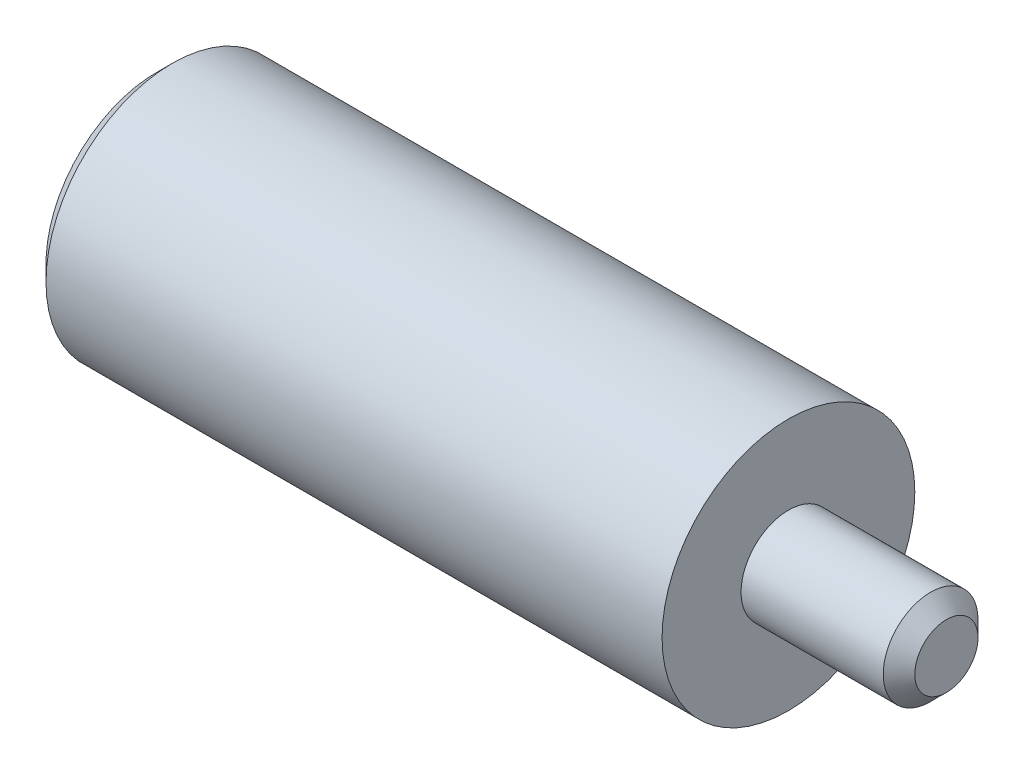
ISO-10303-21;
HEADER;
FILE_DESCRIPTION(('STEP AP214'),'2;1');
FILE_NAME('part.step','',(''),(''),'','','');
FILE_SCHEMA(('AUTOMOTIVE_DESIGN { 1 0 10303 214 1 1 1 1 }'));
ENDSEC;
DATA;
#1=APPLICATION_CONTEXT('core data for automotive mechanical design processes');
#2=APPLICATION_PROTOCOL_DEFINITION('international standard','automotive_design',2000,#1);
#3=PRODUCT_CONTEXT('',#1,'mechanical');
#4=PRODUCT('Part','Part','',(#3));
#5=PRODUCT_RELATED_PRODUCT_CATEGORY('part','',(#4));
#6=PRODUCT_DEFINITION_FORMATION('','',#4);
#7=PRODUCT_DEFINITION_CONTEXT('part definition',#1,'design');
#8=PRODUCT_DEFINITION('design','',#6,#7);
#9=PRODUCT_DEFINITION_SHAPE('','',#8);
#10=(LENGTH_UNIT() NAMED_UNIT(*) SI_UNIT(.MILLI.,.METRE.));
#11=(NAMED_UNIT(*) PLANE_ANGLE_UNIT() SI_UNIT($,.RADIAN.));
#12=(NAMED_UNIT(*) SI_UNIT($,.STERADIAN.) SOLID_ANGLE_UNIT());
#13=UNCERTAINTY_MEASURE_WITH_UNIT(LENGTH_MEASURE(1.E-05),#10,'distance_accuracy_value','');
#14=(GEOMETRIC_REPRESENTATION_CONTEXT(3) GLOBAL_UNCERTAINTY_ASSIGNED_CONTEXT((#13)) GLOBAL_UNIT_ASSIGNED_CONTEXT((#10,
#11,#12)) REPRESENTATION_CONTEXT('',''));
#15=CARTESIAN_POINT('',(0.,0.,0.));
#16=DIRECTION('',(0.,0.,1.));
#17=DIRECTION('',(1.,0.,0.));
#18=AXIS2_PLACEMENT_3D('',#15,#16,#17);
#19=CARTESIAN_POINT('',(20.,0.,0.));
#20=DIRECTION('',(1.,0.,0.));
#21=DIRECTION('',(0.,0.,-1.));
#22=AXIS2_PLACEMENT_3D('',#19,#20,#21);
#23=PLANE('',#22);
#24=CARTESIAN_POINT('',(20.,0.,0.));
#25=DIRECTION('',(1.,0.,0.));
#26=DIRECTION('',(0.,0.,-1.));
#27=AXIS2_PLACEMENT_3D('',#24,#25,#26);
#28=CIRCLE('',#27,4.);
#29=CARTESIAN_POINT('',(20.,0.,-4.));
#30=VERTEX_POINT('',#29);
#31=EDGE_CURVE('E53',#30,#30,#28,.T.);
#32=ORIENTED_EDGE('',*,*,#31,.T.);
#33=EDGE_LOOP('',(#32));
#34=FACE_BOUND('',#33,.T.);
#35=CARTESIAN_POINT('',(20.,0.,0.));
#36=DIRECTION('',(1.,0.,0.));
#37=DIRECTION('',(0.,0.,-1.));
#38=AXIS2_PLACEMENT_3D('',#35,#36,#37);
#39=CIRCLE('',#38,1.5);
#40=CARTESIAN_POINT('',(20.,0.,-1.5));
#41=VERTEX_POINT('',#40);
#42=EDGE_CURVE('E56',#41,#41,#39,.T.);
#43=ORIENTED_EDGE('',*,*,#42,.F.);
#44=EDGE_LOOP('',(#43));
#45=FACE_BOUND('',#44,.T.);
#46=ADVANCED_FACE('F33',(#34,#45),#23,.T.);
#47=CARTESIAN_POINT('',(20.,0.,0.));
#48=DIRECTION('',(-1.,0.,0.));
#49=DIRECTION('',(0.,0.,1.));
#50=AXIS2_PLACEMENT_3D('',#47,#48,#49);
#51=CYLINDRICAL_SURFACE('',#50,4.);
#52=CARTESIAN_POINT('',(0.499999999999997,0.,0.));
#53=DIRECTION('',(1.,0.,0.));
#54=DIRECTION('',(0.,0.,-1.));
#55=AXIS2_PLACEMENT_3D('',#52,#53,#54);
#56=CIRCLE('',#55,4.);
#57=CARTESIAN_POINT('',(0.499999999999997,0.,-4.));
#58=VERTEX_POINT('',#57);
#59=EDGE_CURVE('E48',#58,#58,#56,.T.);
#60=ORIENTED_EDGE('',*,*,#59,.T.);
#61=EDGE_LOOP('',(#60));
#62=FACE_BOUND('',#61,.T.);
#63=ORIENTED_EDGE('',*,*,#31,.F.);
#64=EDGE_LOOP('',(#63));
#65=FACE_BOUND('',#64,.T.);
#66=ADVANCED_FACE('F63',(#62,#65),#51,.T.);
#67=CARTESIAN_POINT('',(0.,0.,0.));
#68=DIRECTION('',(1.,0.,0.));
#69=DIRECTION('',(0.,0.,-1.));
#70=AXIS2_PLACEMENT_3D('',#67,#68,#69);
#71=PLANE('',#70);
#72=CARTESIAN_POINT('',(0.,0.,0.));
#73=DIRECTION('',(1.,0.,0.));
#74=DIRECTION('',(0.,0.,-1.));
#75=AXIS2_PLACEMENT_3D('',#72,#73,#74);
#76=CIRCLE('',#75,3.50000000000001);
#77=CARTESIAN_POINT('',(0.,0.,-3.50000000000001));
#78=VERTEX_POINT('',#77);
#79=EDGE_CURVE('E44',#78,#78,#76,.F.);
#80=ORIENTED_EDGE('',*,*,#79,.T.);
#81=EDGE_LOOP('',(#80));
#82=FACE_BOUND('',#81,.T.);
#83=ADVANCED_FACE('F69',(#82),#71,.F.);
#84=CARTESIAN_POINT('',(25.,0.,0.));
#85=DIRECTION('',(-1.,0.,0.));
#86=DIRECTION('',(0.,0.,1.));
#87=AXIS2_PLACEMENT_3D('',#84,#85,#86);
#88=CYLINDRICAL_SURFACE('',#87,1.5);
#89=CARTESIAN_POINT('',(24.5,0.,0.));
#90=DIRECTION('',(1.,0.,0.));
#91=DIRECTION('',(0.,0.,-1.));
#92=AXIS2_PLACEMENT_3D('',#89,#90,#91);
#93=CIRCLE('',#92,1.5);
#94=CARTESIAN_POINT('',(24.5,0.,-1.5));
#95=VERTEX_POINT('',#94);
#96=EDGE_CURVE('E10',#95,#95,#93,.F.);
#97=ORIENTED_EDGE('',*,*,#96,.T.);
#98=EDGE_LOOP('',(#97));
#99=FACE_BOUND('',#98,.T.);
#100=ORIENTED_EDGE('',*,*,#42,.T.);
#101=EDGE_LOOP('',(#100));
#102=FACE_BOUND('',#101,.T.);
#103=ADVANCED_FACE('F60',(#99,#102),#88,.T.);
#104=CARTESIAN_POINT('',(25.,0.,0.));
#105=DIRECTION('',(1.,0.,0.));
#106=DIRECTION('',(0.,0.,-1.));
#107=AXIS2_PLACEMENT_3D('',#104,#105,#106);
#108=PLANE('',#107);
#109=CARTESIAN_POINT('',(25.,0.,0.));
#110=DIRECTION('',(1.,0.,0.));
#111=DIRECTION('',(0.,0.,-1.));
#112=AXIS2_PLACEMENT_3D('',#109,#110,#111);
#113=CIRCLE('',#112,1.);
#114=CARTESIAN_POINT('',(25.,0.,-1.));
#115=VERTEX_POINT('',#114);
#116=EDGE_CURVE('E40',#115,#115,#113,.T.);
#117=ORIENTED_EDGE('',*,*,#116,.T.);
#118=EDGE_LOOP('',(#117));
#119=FACE_BOUND('',#118,.T.);
#120=ADVANCED_FACE('F79',(#119),#108,.T.);
#121=CARTESIAN_POINT('',(0.499999999999997,0.,0.));
#122=DIRECTION('',(1.,0.,0.));
#123=DIRECTION('',(0.,0.,-1.));
#124=AXIS2_PLACEMENT_3D('',#121,#122,#123);
#125=CONICAL_SURFACE('',#124,4.,0.785398163397445);
#126=ORIENTED_EDGE('',*,*,#79,.F.);
#127=EDGE_LOOP('',(#126));
#128=FACE_BOUND('',#127,.T.);
#129=ORIENTED_EDGE('',*,*,#59,.F.);
#130=EDGE_LOOP('',(#129));
#131=FACE_BOUND('',#130,.T.);
#132=ADVANCED_FACE('F77',(#128,#131),#125,.T.);
#133=CARTESIAN_POINT('',(25.,0.,0.));
#134=DIRECTION('',(-1.,0.,0.));
#135=DIRECTION('',(0.,0.,1.));
#136=AXIS2_PLACEMENT_3D('',#133,#134,#135);
#137=CONICAL_SURFACE('',#136,1.,0.785398163397447);
#138=ORIENTED_EDGE('',*,*,#96,.F.);
#139=EDGE_LOOP('',(#138));
#140=FACE_BOUND('',#139,.T.);
#141=ORIENTED_EDGE('',*,*,#116,.F.);
#142=EDGE_LOOP('',(#141));
#143=FACE_BOUND('',#142,.T.);
#144=ADVANCED_FACE('F35',(#140,#143),#137,.T.);
#145=CLOSED_SHELL('',(#46,#66,#83,#103,#120,#132,#144));
#146=MANIFOLD_SOLID_BREP('B2',#145);
#147=ADVANCED_BREP_SHAPE_REPRESENTATION('',(#18,#146),#14);
#148=SHAPE_DEFINITION_REPRESENTATION(#9,#147);
ENDSEC;
END-ISO-10303-21;
